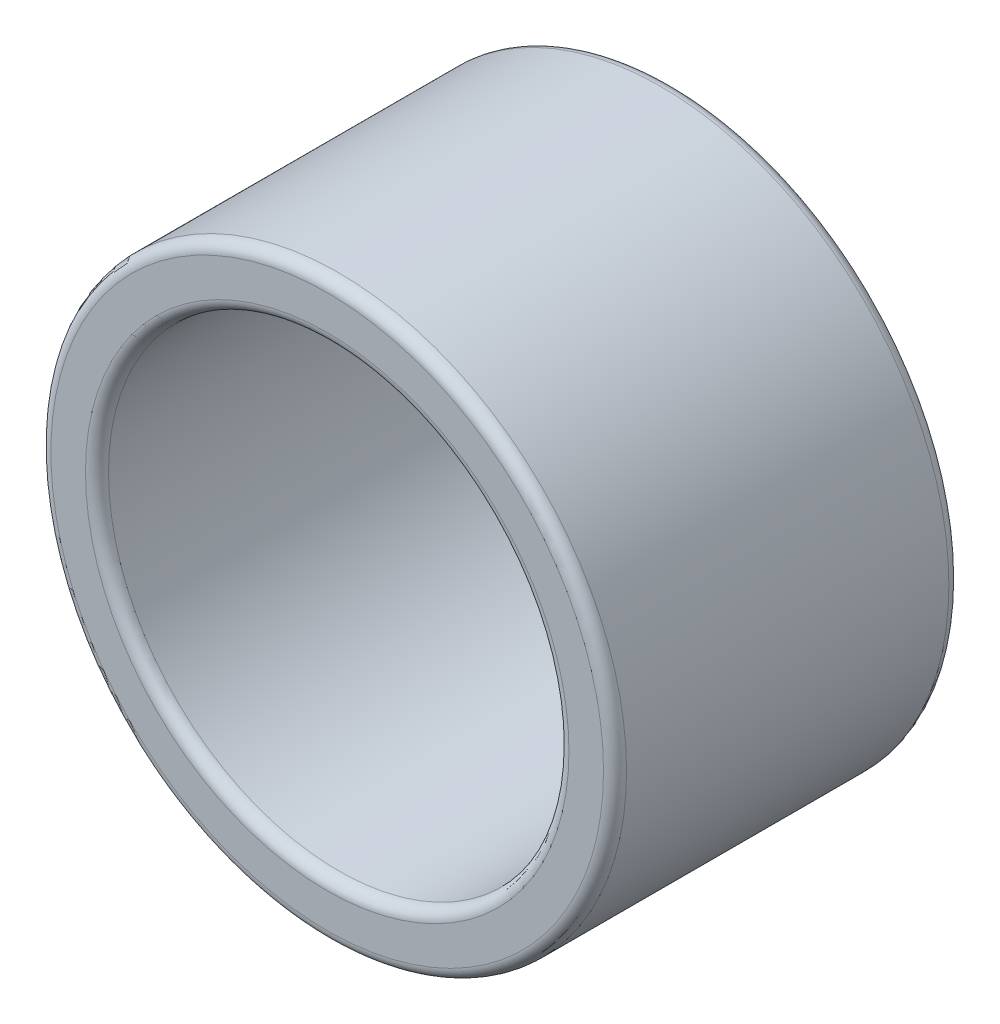
ISO-10303-21;
HEADER;
FILE_DESCRIPTION(('STEP AP214'),'2;1');
FILE_NAME('part.step','',(''),(''),'','','');
FILE_SCHEMA(('AUTOMOTIVE_DESIGN { 1 0 10303 214 1 1 1 1 }'));
ENDSEC;
DATA;
#1=APPLICATION_CONTEXT('core data for automotive mechanical design processes');
#2=APPLICATION_PROTOCOL_DEFINITION('international standard','automotive_design',2000,#1);
#3=PRODUCT_CONTEXT('',#1,'mechanical');
#4=PRODUCT('Part','Part','',(#3));
#5=PRODUCT_RELATED_PRODUCT_CATEGORY('part','',(#4));
#6=PRODUCT_DEFINITION_FORMATION('','',#4);
#7=PRODUCT_DEFINITION_CONTEXT('part definition',#1,'design');
#8=PRODUCT_DEFINITION('design','',#6,#7);
#9=PRODUCT_DEFINITION_SHAPE('','',#8);
#10=(LENGTH_UNIT() NAMED_UNIT(*) SI_UNIT(.MILLI.,.METRE.));
#11=(NAMED_UNIT(*) PLANE_ANGLE_UNIT() SI_UNIT($,.RADIAN.));
#12=(NAMED_UNIT(*) SI_UNIT($,.STERADIAN.) SOLID_ANGLE_UNIT());
#13=UNCERTAINTY_MEASURE_WITH_UNIT(LENGTH_MEASURE(1.E-05),#10,'distance_accuracy_value','');
#14=(GEOMETRIC_REPRESENTATION_CONTEXT(3) GLOBAL_UNCERTAINTY_ASSIGNED_CONTEXT((#13)) GLOBAL_UNIT_ASSIGNED_CONTEXT((#10,
#11,#12)) REPRESENTATION_CONTEXT('',''));
#15=CARTESIAN_POINT('',(0.,0.,0.));
#16=DIRECTION('',(0.,0.,1.));
#17=DIRECTION('',(1.,0.,0.));
#18=AXIS2_PLACEMENT_3D('',#15,#16,#17);
#19=CARTESIAN_POINT('',(0.,0.,-9.));
#20=DIRECTION('',(0.,0.,1.));
#21=DIRECTION('',(1.,0.,0.));
#22=AXIS2_PLACEMENT_3D('',#19,#20,#21);
#23=CYLINDRICAL_SURFACE('',#22,7.5);
#24=CARTESIAN_POINT('',(0.,0.,-0.3));
#25=DIRECTION('',(0.,0.,1.));
#26=DIRECTION('',(1.,0.,0.));
#27=AXIS2_PLACEMENT_3D('',#24,#25,#26);
#28=CIRCLE('',#27,7.5);
#29=CARTESIAN_POINT('',(7.5,0.,-0.3));
#30=VERTEX_POINT('',#29);
#31=EDGE_CURVE('E10',#30,#30,#28,.F.);
#32=ORIENTED_EDGE('',*,*,#31,.T.);
#33=EDGE_LOOP('',(#32));
#34=FACE_BOUND('',#33,.T.);
#35=CARTESIAN_POINT('',(0.,0.,-8.7));
#36=DIRECTION('',(0.,0.,1.));
#37=DIRECTION('',(1.,0.,0.));
#38=AXIS2_PLACEMENT_3D('',#35,#36,#37);
#39=CIRCLE('',#38,7.5);
#40=CARTESIAN_POINT('',(7.5,0.,-8.7));
#41=VERTEX_POINT('',#40);
#42=EDGE_CURVE('E40',#41,#41,#39,.T.);
#43=ORIENTED_EDGE('',*,*,#42,.T.);
#44=EDGE_LOOP('',(#43));
#45=FACE_BOUND('',#44,.T.);
#46=ADVANCED_FACE('F33',(#34,#45),#23,.T.);
#47=CARTESIAN_POINT('',(0.,0.,-9.));
#48=DIRECTION('',(0.,0.,1.));
#49=DIRECTION('',(1.,0.,0.));
#50=AXIS2_PLACEMENT_3D('',#47,#48,#49);
#51=PLANE('',#50);
#52=CARTESIAN_POINT('',(0.,0.,-9.));
#53=DIRECTION('',(0.,0.,1.));
#54=DIRECTION('',(1.,0.,0.));
#55=AXIS2_PLACEMENT_3D('',#52,#53,#54);
#56=CIRCLE('',#55,6.3);
#57=CARTESIAN_POINT('',(6.3,0.,-9.));
#58=VERTEX_POINT('',#57);
#59=EDGE_CURVE('E44',#58,#58,#56,.T.);
#60=ORIENTED_EDGE('',*,*,#59,.T.);
#61=EDGE_LOOP('',(#60));
#62=FACE_BOUND('',#61,.T.);
#63=CARTESIAN_POINT('',(0.,0.,-9.));
#64=DIRECTION('',(0.,0.,1.));
#65=DIRECTION('',(1.,0.,0.));
#66=AXIS2_PLACEMENT_3D('',#63,#64,#65);
#67=CIRCLE('',#66,7.2);
#68=CARTESIAN_POINT('',(7.2,0.,-9.));
#69=VERTEX_POINT('',#68);
#70=EDGE_CURVE('E48',#69,#69,#67,.F.);
#71=ORIENTED_EDGE('',*,*,#70,.T.);
#72=EDGE_LOOP('',(#71));
#73=FACE_BOUND('',#72,.T.);
#74=ADVANCED_FACE('F76',(#62,#73),#51,.F.);
#75=CARTESIAN_POINT('',(0.,0.,0.));
#76=DIRECTION('',(0.,0.,1.));
#77=DIRECTION('',(1.,0.,0.));
#78=AXIS2_PLACEMENT_3D('',#75,#76,#77);
#79=PLANE('',#78);
#80=CARTESIAN_POINT('',(0.,0.,0.));
#81=DIRECTION('',(0.,0.,1.));
#82=DIRECTION('',(1.,0.,0.));
#83=AXIS2_PLACEMENT_3D('',#80,#81,#82);
#84=CIRCLE('',#83,6.3);
#85=CARTESIAN_POINT('',(6.3,0.,0.));
#86=VERTEX_POINT('',#85);
#87=EDGE_CURVE('E53',#86,#86,#84,.F.);
#88=ORIENTED_EDGE('',*,*,#87,.T.);
#89=EDGE_LOOP('',(#88));
#90=FACE_BOUND('',#89,.T.);
#91=CARTESIAN_POINT('',(0.,0.,0.));
#92=DIRECTION('',(0.,0.,1.));
#93=DIRECTION('',(1.,0.,0.));
#94=AXIS2_PLACEMENT_3D('',#91,#92,#93);
#95=CIRCLE('',#94,7.2);
#96=CARTESIAN_POINT('',(7.2,0.,0.));
#97=VERTEX_POINT('',#96);
#98=EDGE_CURVE('E56',#97,#97,#95,.T.);
#99=ORIENTED_EDGE('',*,*,#98,.T.);
#100=EDGE_LOOP('',(#99));
#101=FACE_BOUND('',#100,.T.);
#102=ADVANCED_FACE('F79',(#90,#101),#79,.T.);
#103=CARTESIAN_POINT('',(0.,0.,-9.));
#104=DIRECTION('',(0.,0.,1.));
#105=DIRECTION('',(1.,0.,0.));
#106=AXIS2_PLACEMENT_3D('',#103,#104,#105);
#107=CYLINDRICAL_SURFACE('',#106,6.);
#108=CARTESIAN_POINT('',(0.,0.,-0.3));
#109=DIRECTION('',(0.,0.,1.));
#110=DIRECTION('',(1.,0.,0.));
#111=AXIS2_PLACEMENT_3D('',#108,#109,#110);
#112=CIRCLE('',#111,6.);
#113=CARTESIAN_POINT('',(6.,0.,-0.3));
#114=VERTEX_POINT('',#113);
#115=EDGE_CURVE('E59',#114,#114,#112,.T.);
#116=ORIENTED_EDGE('',*,*,#115,.T.);
#117=EDGE_LOOP('',(#116));
#118=FACE_BOUND('',#117,.T.);
#119=CARTESIAN_POINT('',(0.,0.,-8.7));
#120=DIRECTION('',(0.,0.,1.));
#121=DIRECTION('',(1.,0.,0.));
#122=AXIS2_PLACEMENT_3D('',#119,#120,#121);
#123=CIRCLE('',#122,6.);
#124=CARTESIAN_POINT('',(6.,0.,-8.7));
#125=VERTEX_POINT('',#124);
#126=EDGE_CURVE('E62',#125,#125,#123,.F.);
#127=ORIENTED_EDGE('',*,*,#126,.T.);
#128=EDGE_LOOP('',(#127));
#129=FACE_BOUND('',#128,.T.);
#130=ADVANCED_FACE('F66',(#118,#129),#107,.F.);
#131=CARTESIAN_POINT('',(0.,0.,-0.3));
#132=DIRECTION('',(0.,0.,1.));
#133=DIRECTION('',(1.,0.,0.));
#134=AXIS2_PLACEMENT_3D('',#131,#132,#133);
#135=TOROIDAL_SURFACE('',#134,6.3,0.3);
#136=ORIENTED_EDGE('',*,*,#87,.F.);
#137=EDGE_LOOP('',(#136));
#138=FACE_BOUND('',#137,.T.);
#139=ORIENTED_EDGE('',*,*,#115,.F.);
#140=EDGE_LOOP('',(#139));
#141=FACE_BOUND('',#140,.T.);
#142=ADVANCED_FACE('F72',(#138,#141),#135,.T.);
#143=CARTESIAN_POINT('',(0.,0.,-8.7));
#144=DIRECTION('',(0.,0.,1.));
#145=DIRECTION('',(1.,0.,0.));
#146=AXIS2_PLACEMENT_3D('',#143,#144,#145);
#147=TOROIDAL_SURFACE('',#146,6.3,0.3);
#148=ORIENTED_EDGE('',*,*,#126,.F.);
#149=EDGE_LOOP('',(#148));
#150=FACE_BOUND('',#149,.T.);
#151=ORIENTED_EDGE('',*,*,#59,.F.);
#152=EDGE_LOOP('',(#151));
#153=FACE_BOUND('',#152,.T.);
#154=ADVANCED_FACE('F68',(#150,#153),#147,.T.);
#155=CARTESIAN_POINT('',(0.,0.,-0.3));
#156=DIRECTION('',(0.,0.,1.));
#157=DIRECTION('',(1.,0.,0.));
#158=AXIS2_PLACEMENT_3D('',#155,#156,#157);
#159=TOROIDAL_SURFACE('',#158,7.2,0.3);
#160=ORIENTED_EDGE('',*,*,#31,.F.);
#161=EDGE_LOOP('',(#160));
#162=FACE_BOUND('',#161,.T.);
#163=ORIENTED_EDGE('',*,*,#98,.F.);
#164=EDGE_LOOP('',(#163));
#165=FACE_BOUND('',#164,.T.);
#166=ADVANCED_FACE('F71',(#162,#165),#159,.T.);
#167=CARTESIAN_POINT('',(0.,0.,-8.7));
#168=DIRECTION('',(0.,0.,1.));
#169=DIRECTION('',(1.,0.,0.));
#170=AXIS2_PLACEMENT_3D('',#167,#168,#169);
#171=TOROIDAL_SURFACE('',#170,7.2,0.3);
#172=ORIENTED_EDGE('',*,*,#70,.F.);
#173=EDGE_LOOP('',(#172));
#174=FACE_BOUND('',#173,.T.);
#175=ORIENTED_EDGE('',*,*,#42,.F.);
#176=EDGE_LOOP('',(#175));
#177=FACE_BOUND('',#176,.T.);
#178=ADVANCED_FACE('F35',(#174,#177),#171,.T.);
#179=CLOSED_SHELL('',(#46,#74,#102,#130,#142,#154,#166,#178));
#180=MANIFOLD_SOLID_BREP('B2',#179);
#181=ADVANCED_BREP_SHAPE_REPRESENTATION('',(#18,#180),#14);
#182=SHAPE_DEFINITION_REPRESENTATION(#9,#181);
ENDSEC;
END-ISO-10303-21;
